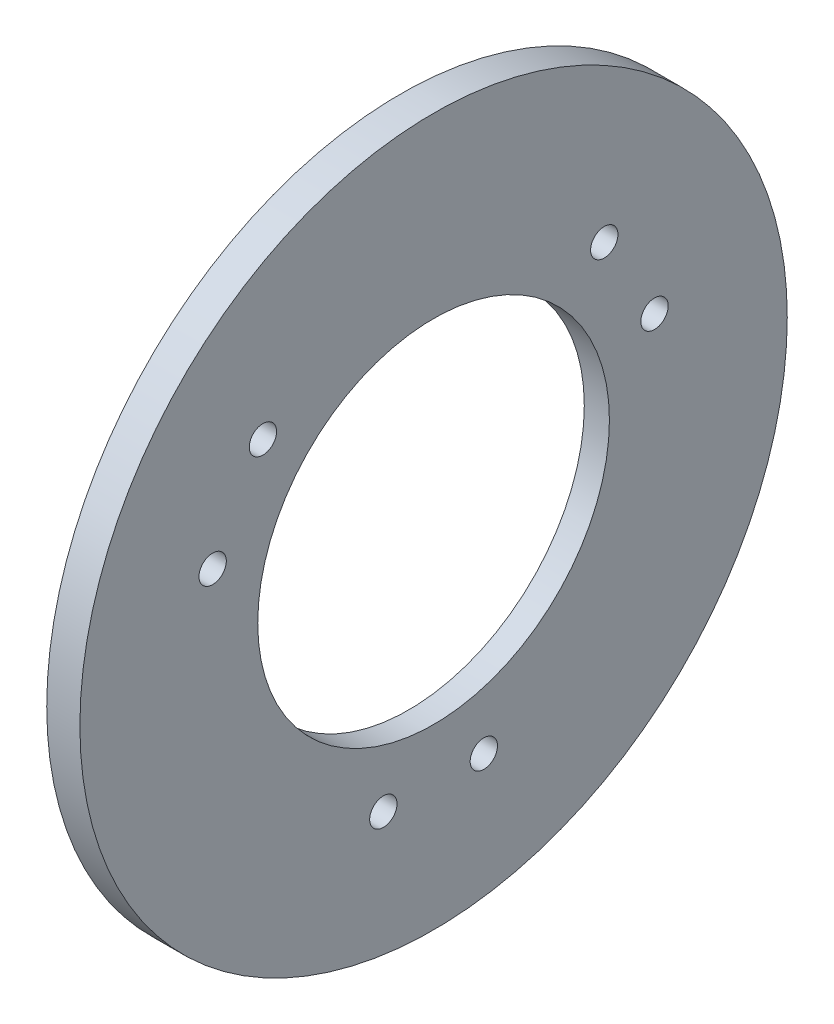
ISO-10303-21;
HEADER;
FILE_DESCRIPTION(('STEP AP214'),'2;1');
FILE_NAME('part.step','',(''),(''),'','','');
FILE_SCHEMA(('AUTOMOTIVE_DESIGN { 1 0 10303 214 1 1 1 1 }'));
ENDSEC;
DATA;
#1=APPLICATION_CONTEXT('core data for automotive mechanical design processes');
#2=APPLICATION_PROTOCOL_DEFINITION('international standard','automotive_design',2000,#1);
#3=PRODUCT_CONTEXT('',#1,'mechanical');
#4=PRODUCT('Part','Part','',(#3));
#5=PRODUCT_RELATED_PRODUCT_CATEGORY('part','',(#4));
#6=PRODUCT_DEFINITION_FORMATION('','',#4);
#7=PRODUCT_DEFINITION_CONTEXT('part definition',#1,'design');
#8=PRODUCT_DEFINITION('design','',#6,#7);
#9=PRODUCT_DEFINITION_SHAPE('','',#8);
#10=(LENGTH_UNIT() NAMED_UNIT(*) SI_UNIT(.MILLI.,.METRE.));
#11=(NAMED_UNIT(*) PLANE_ANGLE_UNIT() SI_UNIT($,.RADIAN.));
#12=(NAMED_UNIT(*) SI_UNIT($,.STERADIAN.) SOLID_ANGLE_UNIT());
#13=UNCERTAINTY_MEASURE_WITH_UNIT(LENGTH_MEASURE(1.E-05),#10,'distance_accuracy_value','');
#14=(GEOMETRIC_REPRESENTATION_CONTEXT(3) GLOBAL_UNCERTAINTY_ASSIGNED_CONTEXT((#13)) GLOBAL_UNIT_ASSIGNED_CONTEXT((#10,
#11,#12)) REPRESENTATION_CONTEXT('',''));
#15=CARTESIAN_POINT('',(0.,0.,0.));
#16=DIRECTION('',(0.,0.,1.));
#17=DIRECTION('',(1.,0.,0.));
#18=AXIS2_PLACEMENT_3D('',#15,#16,#17);
#19=CARTESIAN_POINT('',(-553.390493070476,199.399376692927,0.));
#20=DIRECTION('',(1.,0.,0.));
#21=DIRECTION('',(0.,0.,-1.));
#22=AXIS2_PLACEMENT_3D('',#19,#20,#21);
#23=PLANE('',#22);
#24=CARTESIAN_POINT('',(-553.390493070476,219.186138006957,21.5716759131391));
#25=DIRECTION('',(1.,0.,0.));
#26=DIRECTION('',(0.,0.,-1.));
#27=AXIS2_PLACEMENT_3D('',#24,#25,#26);
#28=CIRCLE('',#27,1.72719999999815);
#29=CARTESIAN_POINT('',(-553.390493070476,219.186138006957,19.844475913141));
#30=VERTEX_POINT('',#29);
#31=EDGE_CURVE('E90',#30,#30,#28,.F.);
#32=ORIENTED_EDGE('',*,*,#31,.F.);
#33=EDGE_LOOP('',(#32));
#34=FACE_BOUND('',#33,.T.);
#35=CARTESIAN_POINT('',(-553.390493070476,208.187615378896,27.9216759131406));
#36=DIRECTION('',(1.,0.,0.));
#37=DIRECTION('',(0.,0.,-1.));
#38=AXIS2_PLACEMENT_3D('',#35,#36,#37);
#39=CIRCLE('',#38,1.72719999999816);
#40=CARTESIAN_POINT('',(-553.390493070476,208.187615378896,26.1944759131424));
#41=VERTEX_POINT('',#40);
#42=EDGE_CURVE('E89',#41,#41,#39,.F.);
#43=ORIENTED_EDGE('',*,*,#42,.F.);
#44=EDGE_LOOP('',(#43));
#45=FACE_BOUND('',#44,.T.);
#46=CARTESIAN_POINT('',(-553.390493070476,170.824376692929,6.34999999999997));
#47=DIRECTION('',(1.,0.,0.));
#48=DIRECTION('',(0.,0.,-1.));
#49=AXIS2_PLACEMENT_3D('',#46,#47,#48);
#50=CIRCLE('',#49,1.72719999999816);
#51=CARTESIAN_POINT('',(-553.390493070476,170.824376692929,4.62280000000181));
#52=VERTEX_POINT('',#51);
#53=EDGE_CURVE('E96',#52,#52,#50,.F.);
#54=ORIENTED_EDGE('',*,*,#53,.F.);
#55=EDGE_LOOP('',(#54));
#56=FACE_BOUND('',#55,.T.);
#57=CARTESIAN_POINT('',(-553.390493070476,170.824376692929,-6.34999999999997));
#58=DIRECTION('',(1.,0.,0.));
#59=DIRECTION('',(0.,0.,-1.));
#60=AXIS2_PLACEMENT_3D('',#57,#58,#59);
#61=CIRCLE('',#60,1.72719999999816);
#62=CARTESIAN_POINT('',(-553.390493070476,170.824376692929,-8.07719999999812));
#63=VERTEX_POINT('',#62);
#64=EDGE_CURVE('E102',#63,#63,#61,.F.);
#65=ORIENTED_EDGE('',*,*,#64,.F.);
#66=EDGE_LOOP('',(#65));
#67=FACE_BOUND('',#66,.T.);
#68=CARTESIAN_POINT('',(-553.390493070476,208.187615378895,-27.9216759131387));
#69=DIRECTION('',(1.,0.,0.));
#70=DIRECTION('',(0.,0.,-1.));
#71=AXIS2_PLACEMENT_3D('',#68,#69,#70);
#72=CIRCLE('',#71,1.72719999999815);
#73=CARTESIAN_POINT('',(-553.390493070476,208.187615378895,-29.6488759131369));
#74=VERTEX_POINT('',#73);
#75=EDGE_CURVE('E108',#74,#74,#72,.F.);
#76=ORIENTED_EDGE('',*,*,#75,.F.);
#77=EDGE_LOOP('',(#76));
#78=FACE_BOUND('',#77,.T.);
#79=CARTESIAN_POINT('',(-553.390493070476,219.186138006958,-21.5716759131401));
#80=DIRECTION('',(1.,0.,0.));
#81=DIRECTION('',(0.,0.,-1.));
#82=AXIS2_PLACEMENT_3D('',#79,#80,#81);
#83=CIRCLE('',#82,1.72719999999815);
#84=CARTESIAN_POINT('',(-553.390493070476,219.186138006958,-23.2988759131382));
#85=VERTEX_POINT('',#84);
#86=EDGE_CURVE('E79',#85,#85,#83,.F.);
#87=ORIENTED_EDGE('',*,*,#86,.F.);
#88=EDGE_LOOP('',(#87));
#89=FACE_BOUND('',#88,.T.);
#90=CARTESIAN_POINT('',(-553.390493070476,199.399376692927,0.));
#91=DIRECTION('',(1.,0.,0.));
#92=DIRECTION('',(0.,0.,-1.));
#93=AXIS2_PLACEMENT_3D('',#90,#91,#92);
#94=CIRCLE('',#93,22.225);
#95=CARTESIAN_POINT('',(-553.390493070476,199.399376692927,-22.225));
#96=VERTEX_POINT('',#95);
#97=EDGE_CURVE('E64',#96,#96,#94,.F.);
#98=ORIENTED_EDGE('',*,*,#97,.F.);
#99=EDGE_LOOP('',(#98));
#100=FACE_BOUND('',#99,.T.);
#101=CARTESIAN_POINT('',(-553.390493070476,199.399376692927,0.));
#102=DIRECTION('',(1.,0.,0.));
#103=DIRECTION('',(0.,0.,-1.));
#104=AXIS2_PLACEMENT_3D('',#101,#102,#103);
#105=CIRCLE('',#104,39.99992);
#106=CARTESIAN_POINT('',(-553.390493070476,199.399376692927,-39.99992));
#107=VERTEX_POINT('',#106);
#108=EDGE_CURVE('E11',#107,#107,#105,.T.);
#109=ORIENTED_EDGE('',*,*,#108,.F.);
#110=EDGE_LOOP('',(#109));
#111=FACE_BOUND('',#110,.T.);
#112=ADVANCED_FACE('F53',(#34,#45,#56,#67,#78,#89,#100,#111),#23,.F.);
#113=CARTESIAN_POINT('',(-550.215493070476,199.399376692927,0.));
#114=DIRECTION('',(-1.,0.,0.));
#115=DIRECTION('',(0.,0.,1.));
#116=AXIS2_PLACEMENT_3D('',#113,#114,#115);
#117=CYLINDRICAL_SURFACE('',#116,44.704);
#118=CARTESIAN_POINT('',(-550.215493070476,199.399376692927,0.));
#119=DIRECTION('',(1.,0.,0.));
#120=DIRECTION('',(0.,0.,-1.));
#121=AXIS2_PLACEMENT_3D('',#118,#119,#120);
#122=CIRCLE('',#121,44.704);
#123=CARTESIAN_POINT('',(-550.215493070476,199.399376692927,-44.704));
#124=VERTEX_POINT('',#123);
#125=EDGE_CURVE('E60',#124,#124,#122,.T.);
#126=ORIENTED_EDGE('',*,*,#125,.F.);
#127=EDGE_LOOP('',(#126));
#128=FACE_BOUND('',#127,.T.);
#129=CARTESIAN_POINT('',(-554.406493070476,199.399376692927,0.));
#130=DIRECTION('',(1.,0.,0.));
#131=DIRECTION('',(0.,0.,-1.));
#132=AXIS2_PLACEMENT_3D('',#129,#130,#131);
#133=CIRCLE('',#132,44.704);
#134=CARTESIAN_POINT('',(-554.406493070476,199.399376692927,-44.704));
#135=VERTEX_POINT('',#134);
#136=EDGE_CURVE('E73',#135,#135,#133,.T.);
#137=ORIENTED_EDGE('',*,*,#136,.T.);
#138=EDGE_LOOP('',(#137));
#139=FACE_BOUND('',#138,.T.);
#140=ADVANCED_FACE('F55',(#128,#139),#117,.T.);
#141=CARTESIAN_POINT('',(-550.215493070476,199.399376692927,0.));
#142=DIRECTION('',(1.,0.,0.));
#143=DIRECTION('',(0.,0.,-1.));
#144=AXIS2_PLACEMENT_3D('',#141,#142,#143);
#145=PLANE('',#144);
#146=CARTESIAN_POINT('',(-550.215493070476,219.186138006957,21.5716759131391));
#147=DIRECTION('',(1.,0.,0.));
#148=DIRECTION('',(0.,0.,-1.));
#149=AXIS2_PLACEMENT_3D('',#146,#147,#148);
#150=CIRCLE('',#149,1.72719999999815);
#151=CARTESIAN_POINT('',(-550.215493070476,219.186138006957,19.844475913141));
#152=VERTEX_POINT('',#151);
#153=EDGE_CURVE('E86',#152,#152,#150,.T.);
#154=ORIENTED_EDGE('',*,*,#153,.F.);
#155=EDGE_LOOP('',(#154));
#156=FACE_BOUND('',#155,.T.);
#157=CARTESIAN_POINT('',(-550.215493070476,208.187615378896,27.9216759131406));
#158=DIRECTION('',(1.,0.,0.));
#159=DIRECTION('',(0.,0.,-1.));
#160=AXIS2_PLACEMENT_3D('',#157,#158,#159);
#161=CIRCLE('',#160,1.72719999999816);
#162=CARTESIAN_POINT('',(-550.215493070476,208.187615378896,26.1944759131424));
#163=VERTEX_POINT('',#162);
#164=EDGE_CURVE('E93',#163,#163,#161,.T.);
#165=ORIENTED_EDGE('',*,*,#164,.F.);
#166=EDGE_LOOP('',(#165));
#167=FACE_BOUND('',#166,.T.);
#168=CARTESIAN_POINT('',(-550.215493070476,170.824376692929,6.34999999999997));
#169=DIRECTION('',(1.,0.,0.));
#170=DIRECTION('',(0.,0.,-1.));
#171=AXIS2_PLACEMENT_3D('',#168,#169,#170);
#172=CIRCLE('',#171,1.72719999999816);
#173=CARTESIAN_POINT('',(-550.215493070476,170.824376692929,4.62280000000181));
#174=VERTEX_POINT('',#173);
#175=EDGE_CURVE('E99',#174,#174,#172,.T.);
#176=ORIENTED_EDGE('',*,*,#175,.F.);
#177=EDGE_LOOP('',(#176));
#178=FACE_BOUND('',#177,.T.);
#179=CARTESIAN_POINT('',(-550.215493070476,170.824376692929,-6.34999999999997));
#180=DIRECTION('',(1.,0.,0.));
#181=DIRECTION('',(0.,0.,-1.));
#182=AXIS2_PLACEMENT_3D('',#179,#180,#181);
#183=CIRCLE('',#182,1.72719999999816);
#184=CARTESIAN_POINT('',(-550.215493070476,170.824376692929,-8.07719999999812));
#185=VERTEX_POINT('',#184);
#186=EDGE_CURVE('E105',#185,#185,#183,.T.);
#187=ORIENTED_EDGE('',*,*,#186,.F.);
#188=EDGE_LOOP('',(#187));
#189=FACE_BOUND('',#188,.T.);
#190=CARTESIAN_POINT('',(-550.215493070476,208.187615378895,-27.9216759131387));
#191=DIRECTION('',(1.,0.,0.));
#192=DIRECTION('',(0.,0.,-1.));
#193=AXIS2_PLACEMENT_3D('',#190,#191,#192);
#194=CIRCLE('',#193,1.72719999999815);
#195=CARTESIAN_POINT('',(-550.215493070476,208.187615378895,-29.6488759131369));
#196=VERTEX_POINT('',#195);
#197=EDGE_CURVE('E85',#196,#196,#194,.T.);
#198=ORIENTED_EDGE('',*,*,#197,.F.);
#199=EDGE_LOOP('',(#198));
#200=FACE_BOUND('',#199,.T.);
#201=CARTESIAN_POINT('',(-550.215493070476,219.186138006958,-21.5716759131401));
#202=DIRECTION('',(1.,0.,0.));
#203=DIRECTION('',(0.,0.,-1.));
#204=AXIS2_PLACEMENT_3D('',#201,#202,#203);
#205=CIRCLE('',#204,1.72719999999815);
#206=CARTESIAN_POINT('',(-550.215493070476,219.186138006958,-23.2988759131382));
#207=VERTEX_POINT('',#206);
#208=EDGE_CURVE('E82',#207,#207,#205,.T.);
#209=ORIENTED_EDGE('',*,*,#208,.F.);
#210=EDGE_LOOP('',(#209));
#211=FACE_BOUND('',#210,.T.);
#212=CARTESIAN_POINT('',(-550.215493070476,199.399376692927,0.));
#213=DIRECTION('',(1.,0.,0.));
#214=DIRECTION('',(0.,0.,-1.));
#215=AXIS2_PLACEMENT_3D('',#212,#213,#214);
#216=CIRCLE('',#215,22.225);
#217=CARTESIAN_POINT('',(-550.215493070476,199.399376692927,-22.225));
#218=VERTEX_POINT('',#217);
#219=EDGE_CURVE('E68',#218,#218,#216,.T.);
#220=ORIENTED_EDGE('',*,*,#219,.F.);
#221=EDGE_LOOP('',(#220));
#222=FACE_BOUND('',#221,.T.);
#223=ORIENTED_EDGE('',*,*,#125,.T.);
#224=EDGE_LOOP('',(#223));
#225=FACE_BOUND('',#224,.T.);
#226=ADVANCED_FACE('F129',(#156,#167,#178,#189,#200,#211,#222,#225),#145,.T.);
#227=CARTESIAN_POINT('',(-685.421486070476,199.399376692927,0.));
#228=DIRECTION('',(1.,0.,0.));
#229=DIRECTION('',(0.,0.,-1.));
#230=AXIS2_PLACEMENT_3D('',#227,#228,#229);
#231=CYLINDRICAL_SURFACE('',#230,22.225);
#232=ORIENTED_EDGE('',*,*,#219,.T.);
#233=EDGE_LOOP('',(#232));
#234=FACE_BOUND('',#233,.T.);
#235=ORIENTED_EDGE('',*,*,#97,.T.);
#236=EDGE_LOOP('',(#235));
#237=FACE_BOUND('',#236,.T.);
#238=ADVANCED_FACE('F126',(#234,#237),#231,.F.);
#239=CARTESIAN_POINT('',(-554.406493070476,199.399376692927,0.));
#240=DIRECTION('',(1.,0.,0.));
#241=DIRECTION('',(0.,0.,-1.));
#242=AXIS2_PLACEMENT_3D('',#239,#240,#241);
#243=PLANE('',#242);
#244=CARTESIAN_POINT('',(-554.406493070476,199.399376692927,0.));
#245=DIRECTION('',(1.,0.,0.));
#246=DIRECTION('',(0.,0.,-1.));
#247=AXIS2_PLACEMENT_3D('',#244,#245,#246);
#248=CIRCLE('',#247,39.99992);
#249=CARTESIAN_POINT('',(-554.406493070476,199.399376692927,-39.99992));
#250=VERTEX_POINT('',#249);
#251=EDGE_CURVE('E76',#250,#250,#248,.T.);
#252=ORIENTED_EDGE('',*,*,#251,.T.);
#253=EDGE_LOOP('',(#252));
#254=FACE_BOUND('',#253,.T.);
#255=ORIENTED_EDGE('',*,*,#136,.F.);
#256=EDGE_LOOP('',(#255));
#257=FACE_BOUND('',#256,.T.);
#258=ADVANCED_FACE('F128',(#254,#257),#243,.F.);
#259=CARTESIAN_POINT('',(-554.406493070476,199.399376692927,0.));
#260=DIRECTION('',(1.,0.,0.));
#261=DIRECTION('',(0.,0.,-1.));
#262=AXIS2_PLACEMENT_3D('',#259,#260,#261);
#263=CYLINDRICAL_SURFACE('',#262,39.99992);
#264=ORIENTED_EDGE('',*,*,#251,.F.);
#265=EDGE_LOOP('',(#264));
#266=FACE_BOUND('',#265,.T.);
#267=ORIENTED_EDGE('',*,*,#108,.T.);
#268=EDGE_LOOP('',(#267));
#269=FACE_BOUND('',#268,.T.);
#270=ADVANCED_FACE('F136',(#266,#269),#263,.F.);
#271=CARTESIAN_POINT('',(-685.421486070476,219.186138006958,-21.5716759131401));
#272=DIRECTION('',(1.,0.,0.));
#273=DIRECTION('',(0.,0.,-1.));
#274=AXIS2_PLACEMENT_3D('',#271,#272,#273);
#275=CYLINDRICAL_SURFACE('',#274,1.72719999999815);
#276=ORIENTED_EDGE('',*,*,#208,.T.);
#277=EDGE_LOOP('',(#276));
#278=FACE_BOUND('',#277,.T.);
#279=ORIENTED_EDGE('',*,*,#86,.T.);
#280=EDGE_LOOP('',(#279));
#281=FACE_BOUND('',#280,.T.);
#282=ADVANCED_FACE('F145',(#278,#281),#275,.F.);
#283=CARTESIAN_POINT('',(-685.421486070476,208.187615378895,-27.9216759131387));
#284=DIRECTION('',(1.,0.,0.));
#285=DIRECTION('',(0.,0.,-1.));
#286=AXIS2_PLACEMENT_3D('',#283,#284,#285);
#287=CYLINDRICAL_SURFACE('',#286,1.72719999999815);
#288=ORIENTED_EDGE('',*,*,#197,.T.);
#289=EDGE_LOOP('',(#288));
#290=FACE_BOUND('',#289,.T.);
#291=ORIENTED_EDGE('',*,*,#75,.T.);
#292=EDGE_LOOP('',(#291));
#293=FACE_BOUND('',#292,.T.);
#294=ADVANCED_FACE('F116',(#290,#293),#287,.F.);
#295=CARTESIAN_POINT('',(-685.421486070476,170.824376692929,-6.34999999999997));
#296=DIRECTION('',(1.,0.,0.));
#297=DIRECTION('',(0.,0.,-1.));
#298=AXIS2_PLACEMENT_3D('',#295,#296,#297);
#299=CYLINDRICAL_SURFACE('',#298,1.72719999999816);
#300=ORIENTED_EDGE('',*,*,#186,.T.);
#301=EDGE_LOOP('',(#300));
#302=FACE_BOUND('',#301,.T.);
#303=ORIENTED_EDGE('',*,*,#64,.T.);
#304=EDGE_LOOP('',(#303));
#305=FACE_BOUND('',#304,.T.);
#306=ADVANCED_FACE('F161',(#302,#305),#299,.F.);
#307=CARTESIAN_POINT('',(-685.421486070476,170.824376692929,6.34999999999997));
#308=DIRECTION('',(1.,0.,0.));
#309=DIRECTION('',(0.,0.,-1.));
#310=AXIS2_PLACEMENT_3D('',#307,#308,#309);
#311=CYLINDRICAL_SURFACE('',#310,1.72719999999816);
#312=ORIENTED_EDGE('',*,*,#175,.T.);
#313=EDGE_LOOP('',(#312));
#314=FACE_BOUND('',#313,.T.);
#315=ORIENTED_EDGE('',*,*,#53,.T.);
#316=EDGE_LOOP('',(#315));
#317=FACE_BOUND('',#316,.T.);
#318=ADVANCED_FACE('F157',(#314,#317),#311,.F.);
#319=CARTESIAN_POINT('',(-685.421486070476,208.187615378896,27.9216759131406));
#320=DIRECTION('',(1.,0.,0.));
#321=DIRECTION('',(0.,0.,-1.));
#322=AXIS2_PLACEMENT_3D('',#319,#320,#321);
#323=CYLINDRICAL_SURFACE('',#322,1.72719999999816);
#324=ORIENTED_EDGE('',*,*,#164,.T.);
#325=EDGE_LOOP('',(#324));
#326=FACE_BOUND('',#325,.T.);
#327=ORIENTED_EDGE('',*,*,#42,.T.);
#328=EDGE_LOOP('',(#327));
#329=FACE_BOUND('',#328,.T.);
#330=ADVANCED_FACE('F153',(#326,#329),#323,.F.);
#331=CARTESIAN_POINT('',(-685.421486070476,219.186138006957,21.5716759131391));
#332=DIRECTION('',(1.,0.,0.));
#333=DIRECTION('',(0.,0.,-1.));
#334=AXIS2_PLACEMENT_3D('',#331,#332,#333);
#335=CYLINDRICAL_SURFACE('',#334,1.72719999999815);
#336=ORIENTED_EDGE('',*,*,#153,.T.);
#337=EDGE_LOOP('',(#336));
#338=FACE_BOUND('',#337,.T.);
#339=ORIENTED_EDGE('',*,*,#31,.T.);
#340=EDGE_LOOP('',(#339));
#341=FACE_BOUND('',#340,.T.);
#342=ADVANCED_FACE('F150',(#338,#341),#335,.F.);
#343=CLOSED_SHELL('',(#112,#140,#226,#238,#258,#270,#282,#294,#306,#318,#330,#342));
#344=MANIFOLD_SOLID_BREP('B2',#343);
#345=ADVANCED_BREP_SHAPE_REPRESENTATION('',(#18,#344),#14);
#346=SHAPE_DEFINITION_REPRESENTATION(#9,#345);
ENDSEC;
END-ISO-10303-21;
